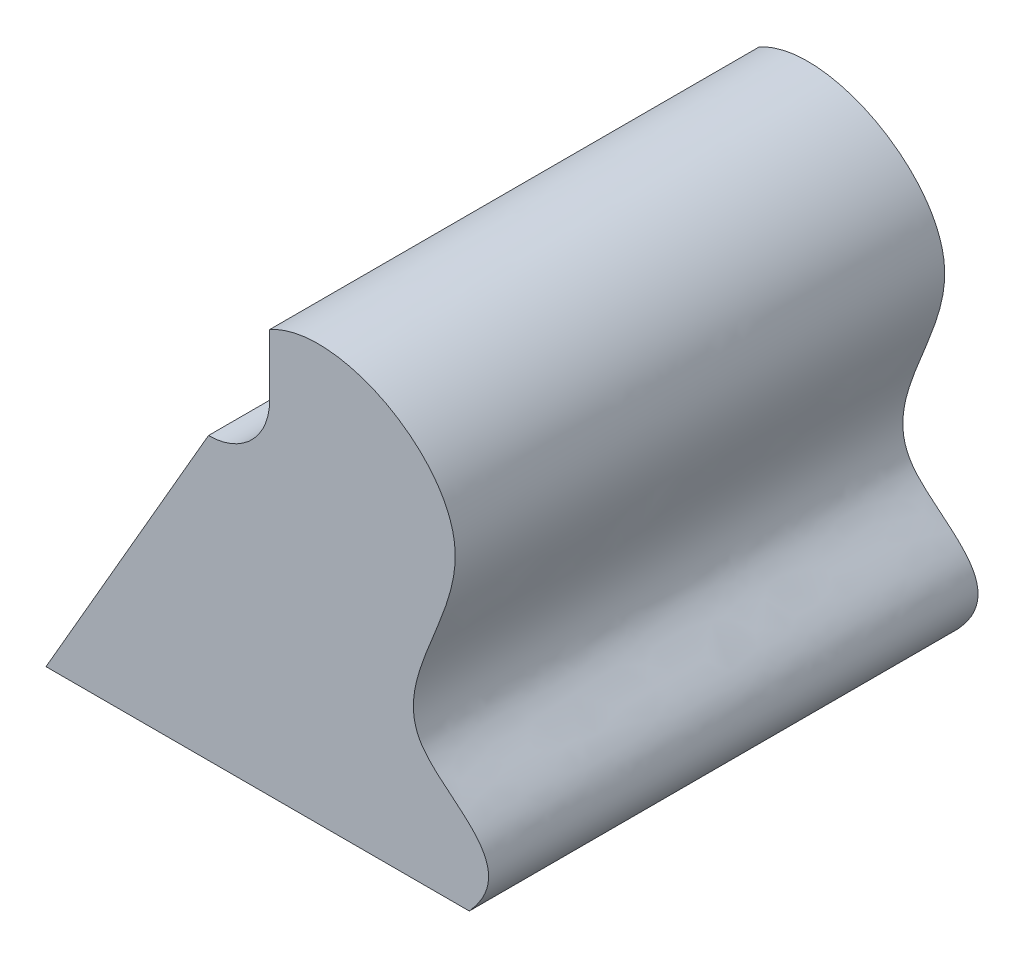
ISO-10303-21;
HEADER;
FILE_DESCRIPTION(('STEP AP214'),'2;1');
FILE_NAME('part.step','',(''),(''),'','','');
FILE_SCHEMA(('AUTOMOTIVE_DESIGN { 1 0 10303 214 1 1 1 1 }'));
ENDSEC;
DATA;
#1=APPLICATION_CONTEXT('core data for automotive mechanical design processes');
#2=APPLICATION_PROTOCOL_DEFINITION('international standard','automotive_design',2000,#1);
#3=PRODUCT_CONTEXT('',#1,'mechanical');
#4=PRODUCT('Part','Part','',(#3));
#5=PRODUCT_RELATED_PRODUCT_CATEGORY('part','',(#4));
#6=PRODUCT_DEFINITION_FORMATION('','',#4);
#7=PRODUCT_DEFINITION_CONTEXT('part definition',#1,'design');
#8=PRODUCT_DEFINITION('design','',#6,#7);
#9=PRODUCT_DEFINITION_SHAPE('','',#8);
#10=(LENGTH_UNIT() NAMED_UNIT(*) SI_UNIT(.MILLI.,.METRE.));
#11=(NAMED_UNIT(*) PLANE_ANGLE_UNIT() SI_UNIT($,.RADIAN.));
#12=(NAMED_UNIT(*) SI_UNIT($,.STERADIAN.) SOLID_ANGLE_UNIT());
#13=UNCERTAINTY_MEASURE_WITH_UNIT(LENGTH_MEASURE(1.E-05),#10,'distance_accuracy_value','');
#14=(GEOMETRIC_REPRESENTATION_CONTEXT(3) GLOBAL_UNCERTAINTY_ASSIGNED_CONTEXT((#13)) GLOBAL_UNIT_ASSIGNED_CONTEXT((#10,
#11,#12)) REPRESENTATION_CONTEXT('',''));
#15=CARTESIAN_POINT('',(0.,0.,0.));
#16=DIRECTION('',(0.,0.,1.));
#17=DIRECTION('',(1.,0.,0.));
#18=AXIS2_PLACEMENT_3D('',#15,#16,#17);
#19=CARTESIAN_POINT('',(2.7578355381241,0.,20.));
#20=DIRECTION('',(0.866025403784439,-0.5,0.));
#21=DIRECTION('',(0.5,0.866025403784439,0.));
#22=AXIS2_PLACEMENT_3D('',#19,#20,#21);
#23=PLANE('',#22);
#24=DIRECTION('',(-0.5,-0.866025403784439,0.));
#25=VECTOR('',#24,1.);
#26=CARTESIAN_POINT('',(2.7578355381241,0.,-20.));
#27=LINE('',#26,#25);
#28=CARTESIAN_POINT('',(16.0368917294855,23.,-20.));
#29=VERTEX_POINT('',#28);
#30=CARTESIAN_POINT('',(2.7578355381241,0.,-20.));
#31=VERTEX_POINT('',#30);
#32=EDGE_CURVE('E109',#29,#31,#27,.T.);
#33=ORIENTED_EDGE('',*,*,#32,.T.);
#34=DIRECTION('',(0.,0.,-1.));
#35=VECTOR('',#34,1.);
#36=CARTESIAN_POINT('',(2.7578355381241,0.,20.));
#37=LINE('',#36,#35);
#38=CARTESIAN_POINT('',(2.7578355381241,0.,20.));
#39=VERTEX_POINT('',#38);
#40=EDGE_CURVE('E11',#39,#31,#37,.T.);
#41=ORIENTED_EDGE('',*,*,#40,.F.);
#42=DIRECTION('',(-0.5,-0.866025403784439,0.));
#43=VECTOR('',#42,1.);
#44=CARTESIAN_POINT('',(2.7578355381241,0.,20.));
#45=LINE('',#44,#43);
#46=CARTESIAN_POINT('',(16.0368917294855,23.,20.));
#47=VERTEX_POINT('',#46);
#48=EDGE_CURVE('E122',#47,#39,#45,.T.);
#49=ORIENTED_EDGE('',*,*,#48,.F.);
#50=DIRECTION('',(0.,0.,-1.));
#51=VECTOR('',#50,1.);
#52=CARTESIAN_POINT('',(16.0368917294855,23.,20.));
#53=LINE('',#52,#51);
#54=EDGE_CURVE('E102',#47,#29,#53,.T.);
#55=ORIENTED_EDGE('',*,*,#54,.T.);
#56=EDGE_LOOP('',(#33,#41,#49,#55));
#57=FACE_BOUND('',#56,.T.);
#58=ADVANCED_FACE('F32',(#57),#23,.F.);
#59=CARTESIAN_POINT('',(2.7578355381241,0.,20.));
#60=DIRECTION('',(0.,1.,0.));
#61=DIRECTION('',(-1.,0.,0.));
#62=AXIS2_PLACEMENT_3D('',#59,#60,#61);
#63=PLANE('',#62);
#64=DIRECTION('',(1.,0.,0.));
#65=VECTOR('',#64,1.);
#66=CARTESIAN_POINT('',(2.7578355381241,0.,-20.));
#67=LINE('',#66,#65);
#68=CARTESIAN_POINT('',(37.3506881439987,0.,-20.));
#69=VERTEX_POINT('',#68);
#70=EDGE_CURVE('E112',#31,#69,#67,.T.);
#71=ORIENTED_EDGE('',*,*,#70,.T.);
#72=DIRECTION('',(0.,0.,-1.));
#73=VECTOR('',#72,1.);
#74=CARTESIAN_POINT('',(37.3506881439987,0.,20.));
#75=LINE('',#74,#73);
#76=CARTESIAN_POINT('',(37.3506881439987,0.,20.));
#77=VERTEX_POINT('',#76);
#78=EDGE_CURVE('E40',#77,#69,#75,.T.);
#79=ORIENTED_EDGE('',*,*,#78,.F.);
#80=DIRECTION('',(1.,0.,0.));
#81=VECTOR('',#80,1.);
#82=CARTESIAN_POINT('',(2.7578355381241,0.,20.));
#83=LINE('',#82,#81);
#84=EDGE_CURVE('E82',#39,#77,#83,.T.);
#85=ORIENTED_EDGE('',*,*,#84,.F.);
#86=ORIENTED_EDGE('',*,*,#40,.T.);
#87=EDGE_LOOP('',(#71,#79,#85,#86));
#88=FACE_BOUND('',#87,.T.);
#89=ADVANCED_FACE('F141',(#88),#63,.F.);
#90=CARTESIAN_POINT('',(37.3506881439987,0.,20.));
#91=CARTESIAN_POINT('',(41.9624052917337,5.08728851420872,20.));
#92=CARTESIAN_POINT('',(26.6832418176357,9.13386158159293,20.));
#93=CARTESIAN_POINT('',(43.2322353691297,27.2396445153218,20.));
#94=CARTESIAN_POINT('',(26.6562787707207,36.134424551167,20.));
#95=CARTESIAN_POINT('',(21.0368917294855,33.,20.));
#96=B_SPLINE_CURVE_WITH_KNOTS('',3,(#90,#91,#92,#93,#94,#95),.UNSPECIFIED.,.F.,.F.,(4,1,1,4),
(0.,0.263847527782791,0.594826113412174,1.),.UNSPECIFIED.);
#97=DIRECTION('',(0.,0.,-1.));
#98=VECTOR('',#97,1.);
#99=SURFACE_OF_LINEAR_EXTRUSION('',#96,#98);
#100=CARTESIAN_POINT('',(37.3506881439987,0.,-20.));
#101=CARTESIAN_POINT('',(41.9624052917337,5.08728851420872,-20.));
#102=CARTESIAN_POINT('',(26.6832418176357,9.13386158159293,-20.));
#103=CARTESIAN_POINT('',(43.2322353691297,27.2396445153218,-20.));
#104=CARTESIAN_POINT('',(26.6562787707207,36.134424551167,-20.));
#105=CARTESIAN_POINT('',(21.0368917294855,33.,-20.));
#106=B_SPLINE_CURVE_WITH_KNOTS('',3,(#100,#101,#102,#103,#104,#105),.UNSPECIFIED.,.F.,.F.,(4,1,
1,4),(0.,0.263847527782791,0.594826113412174,1.),.UNSPECIFIED.);
#107=CARTESIAN_POINT('',(21.0368917294855,33.,-20.));
#108=VERTEX_POINT('',#107);
#109=EDGE_CURVE('E97',#69,#108,#106,.T.);
#110=ORIENTED_EDGE('',*,*,#109,.T.);
#111=DIRECTION('',(0.,0.,-1.));
#112=VECTOR('',#111,1.);
#113=CARTESIAN_POINT('',(21.0368917294855,33.,20.));
#114=LINE('',#113,#112);
#115=CARTESIAN_POINT('',(21.0368917294855,33.,20.));
#116=VERTEX_POINT('',#115);
#117=EDGE_CURVE('E94',#116,#108,#114,.T.);
#118=ORIENTED_EDGE('',*,*,#117,.F.);
#119=EDGE_CURVE('E86',#77,#116,#96,.T.);
#120=ORIENTED_EDGE('',*,*,#119,.F.);
#121=ORIENTED_EDGE('',*,*,#78,.T.);
#122=EDGE_LOOP('',(#110,#118,#120,#121));
#123=FACE_BOUND('',#122,.T.);
#124=ADVANCED_FACE('F95',(#123),#99,.F.);
#125=CARTESIAN_POINT('',(21.0368917294855,33.,20.));
#126=DIRECTION('',(1.,0.,0.));
#127=DIRECTION('',(0.,1.,0.));
#128=AXIS2_PLACEMENT_3D('',#125,#126,#127);
#129=PLANE('',#128);
#130=DIRECTION('',(0.,-1.,0.));
#131=VECTOR('',#130,1.);
#132=CARTESIAN_POINT('',(21.0368917294855,33.,-20.));
#133=LINE('',#132,#131);
#134=CARTESIAN_POINT('',(21.0368917294855,28.,-20.));
#135=VERTEX_POINT('',#134);
#136=EDGE_CURVE('E68',#108,#135,#133,.T.);
#137=ORIENTED_EDGE('',*,*,#136,.T.);
#138=DIRECTION('',(0.,0.,-1.));
#139=VECTOR('',#138,1.);
#140=CARTESIAN_POINT('',(21.0368917294855,28.,20.));
#141=LINE('',#140,#139);
#142=CARTESIAN_POINT('',(21.0368917294855,28.,20.));
#143=VERTEX_POINT('',#142);
#144=EDGE_CURVE('E98',#143,#135,#141,.T.);
#145=ORIENTED_EDGE('',*,*,#144,.F.);
#146=DIRECTION('',(0.,-1.,0.));
#147=VECTOR('',#146,1.);
#148=CARTESIAN_POINT('',(21.0368917294855,33.,20.));
#149=LINE('',#148,#147);
#150=EDGE_CURVE('E90',#116,#143,#149,.T.);
#151=ORIENTED_EDGE('',*,*,#150,.F.);
#152=ORIENTED_EDGE('',*,*,#117,.T.);
#153=EDGE_LOOP('',(#137,#145,#151,#152));
#154=FACE_BOUND('',#153,.T.);
#155=ADVANCED_FACE('F100',(#154),#129,.F.);
#156=CARTESIAN_POINT('',(16.0368917294855,28.,20.));
#157=DIRECTION('',(0.,0.,-1.));
#158=DIRECTION('',(-1.,0.,0.));
#159=AXIS2_PLACEMENT_3D('',#156,#157,#158);
#160=CYLINDRICAL_SURFACE('',#159,5.);
#161=CARTESIAN_POINT('',(16.0368917294855,28.,-20.));
#162=DIRECTION('',(0.,0.,-1.));
#163=DIRECTION('',(1.,0.,0.));
#164=AXIS2_PLACEMENT_3D('',#161,#162,#163);
#165=CIRCLE('',#164,5.);
#166=EDGE_CURVE('E74',#135,#29,#165,.T.);
#167=ORIENTED_EDGE('',*,*,#166,.T.);
#168=ORIENTED_EDGE('',*,*,#54,.F.);
#169=CARTESIAN_POINT('',(16.0368917294855,28.,20.));
#170=DIRECTION('',(0.,0.,-1.));
#171=DIRECTION('',(1.,0.,0.));
#172=AXIS2_PLACEMENT_3D('',#169,#170,#171);
#173=CIRCLE('',#172,5.);
#174=EDGE_CURVE('E48',#143,#47,#173,.T.);
#175=ORIENTED_EDGE('',*,*,#174,.F.);
#176=ORIENTED_EDGE('',*,*,#144,.T.);
#177=EDGE_LOOP('',(#167,#168,#175,#176));
#178=FACE_BOUND('',#177,.T.);
#179=ADVANCED_FACE('F130',(#178),#160,.F.);
#180=CARTESIAN_POINT('',(16.0368917294855,28.,20.));
#181=DIRECTION('',(0.,0.,1.));
#182=DIRECTION('',(1.,0.,0.));
#183=AXIS2_PLACEMENT_3D('',#180,#181,#182);
#184=PLANE('',#183);
#185=ORIENTED_EDGE('',*,*,#48,.T.);
#186=ORIENTED_EDGE('',*,*,#84,.T.);
#187=ORIENTED_EDGE('',*,*,#119,.T.);
#188=ORIENTED_EDGE('',*,*,#150,.T.);
#189=ORIENTED_EDGE('',*,*,#174,.T.);
#190=EDGE_LOOP('',(#185,#186,#187,#188,#189));
#191=FACE_BOUND('',#190,.T.);
#192=ADVANCED_FACE('F88',(#191),#184,.T.);
#193=CARTESIAN_POINT('',(16.0368917294855,28.,-20.));
#194=DIRECTION('',(0.,0.,1.));
#195=DIRECTION('',(1.,0.,0.));
#196=AXIS2_PLACEMENT_3D('',#193,#194,#195);
#197=PLANE('',#196);
#198=ORIENTED_EDGE('',*,*,#32,.F.);
#199=ORIENTED_EDGE('',*,*,#166,.F.);
#200=ORIENTED_EDGE('',*,*,#136,.F.);
#201=ORIENTED_EDGE('',*,*,#109,.F.);
#202=ORIENTED_EDGE('',*,*,#70,.F.);
#203=EDGE_LOOP('',(#198,#199,#200,#201,#202));
#204=FACE_BOUND('',#203,.T.);
#205=ADVANCED_FACE('F126',(#204),#197,.F.);
#206=CLOSED_SHELL('',(#58,#89,#124,#155,#179,#192,#205));
#207=MANIFOLD_SOLID_BREP('B2',#206);
#208=ADVANCED_BREP_SHAPE_REPRESENTATION('',(#18,#207),#14);
#209=SHAPE_DEFINITION_REPRESENTATION(#9,#208);
ENDSEC;
END-ISO-10303-21;
